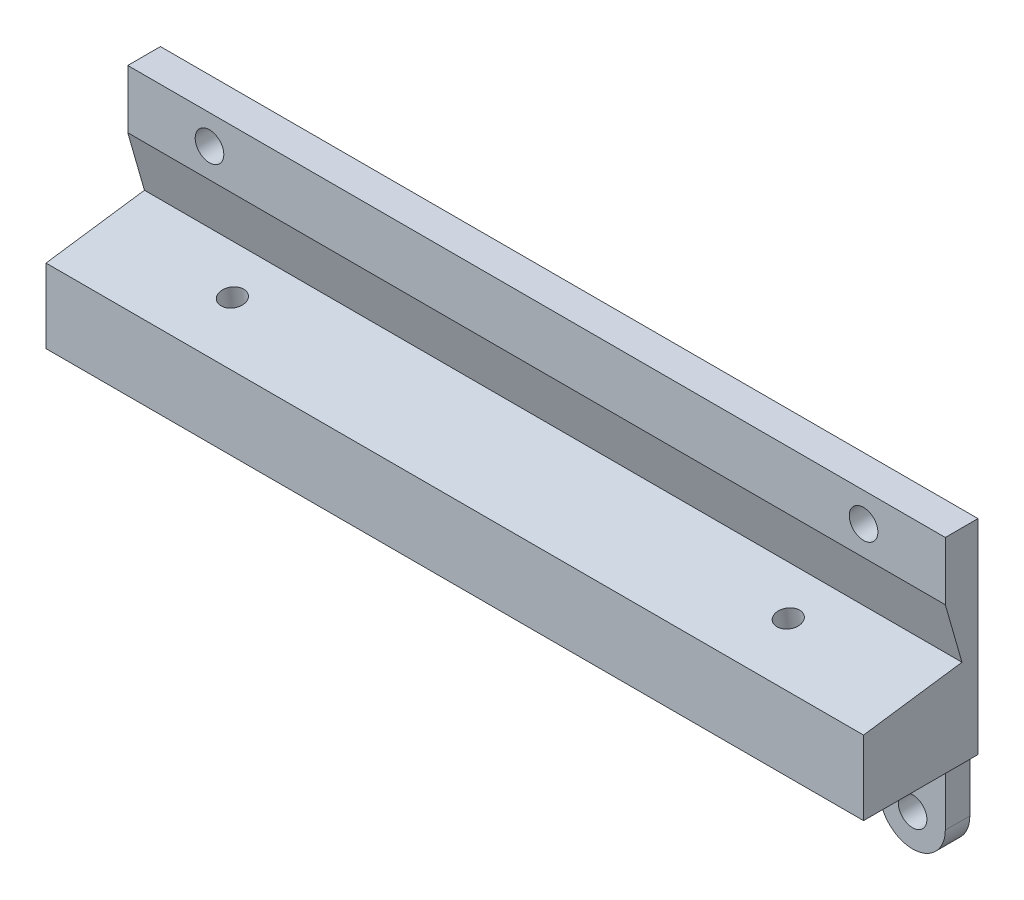
ISO-10303-21;
HEADER;
FILE_DESCRIPTION(('STEP AP214'),'2;1');
FILE_NAME('part.step','',(''),(''),'','','');
FILE_SCHEMA(('AUTOMOTIVE_DESIGN { 1 0 10303 214 1 1 1 1 }'));
ENDSEC;
DATA;
#1=APPLICATION_CONTEXT('core data for automotive mechanical design processes');
#2=APPLICATION_PROTOCOL_DEFINITION('international standard','automotive_design',2000,#1);
#3=PRODUCT_CONTEXT('',#1,'mechanical');
#4=PRODUCT('Part','Part','',(#3));
#5=PRODUCT_RELATED_PRODUCT_CATEGORY('part','',(#4));
#6=PRODUCT_DEFINITION_FORMATION('','',#4);
#7=PRODUCT_DEFINITION_CONTEXT('part definition',#1,'design');
#8=PRODUCT_DEFINITION('design','',#6,#7);
#9=PRODUCT_DEFINITION_SHAPE('','',#8);
#10=(LENGTH_UNIT() NAMED_UNIT(*) SI_UNIT(.MILLI.,.METRE.));
#11=(NAMED_UNIT(*) PLANE_ANGLE_UNIT() SI_UNIT($,.RADIAN.));
#12=(NAMED_UNIT(*) SI_UNIT($,.STERADIAN.) SOLID_ANGLE_UNIT());
#13=UNCERTAINTY_MEASURE_WITH_UNIT(LENGTH_MEASURE(1.E-05),#10,'distance_accuracy_value','');
#14=(GEOMETRIC_REPRESENTATION_CONTEXT(3) GLOBAL_UNCERTAINTY_ASSIGNED_CONTEXT((#13)) GLOBAL_UNIT_ASSIGNED_CONTEXT((#10,
#11,#12)) REPRESENTATION_CONTEXT('',''));
#15=CARTESIAN_POINT('',(0.,0.,0.));
#16=DIRECTION('',(0.,0.,1.));
#17=DIRECTION('',(1.,0.,0.));
#18=AXIS2_PLACEMENT_3D('',#15,#16,#17);
#19=CARTESIAN_POINT('',(0.,0.,4.));
#20=DIRECTION('',(0.,1.,0.));
#21=DIRECTION('',(0.,0.,1.));
#22=AXIS2_PLACEMENT_3D('',#19,#20,#21);
#23=PLANE('',#22);
#24=CARTESIAN_POINT('',(84.,0.,5.79817425479947));
#25=DIRECTION('',(0.,1.,0.));
#26=DIRECTION('',(0.,0.,1.));
#27=AXIS2_PLACEMENT_3D('',#24,#25,#26);
#28=ELLIPSE('',#27,1.41375860152607,1.4);
#29=CARTESIAN_POINT('',(84.,0.,7.21193285632554));
#30=VERTEX_POINT('',#29);
#31=EDGE_CURVE('E228',#30,#30,#28,.T.);
#32=ORIENTED_EDGE('',*,*,#31,.T.);
#33=EDGE_LOOP('',(#32));
#34=FACE_BOUND('',#33,.T.);
#35=CARTESIAN_POINT('',(16.,0.,5.79817425479947));
#36=DIRECTION('',(0.,1.,0.));
#37=DIRECTION('',(0.,0.,1.));
#38=AXIS2_PLACEMENT_3D('',#35,#36,#37);
#39=ELLIPSE('',#38,1.41375860152606,1.4);
#40=CARTESIAN_POINT('',(16.,0.,7.21193285632554));
#41=VERTEX_POINT('',#40);
#42=EDGE_CURVE('E233',#41,#41,#39,.T.);
#43=ORIENTED_EDGE('',*,*,#42,.T.);
#44=EDGE_LOOP('',(#43));
#45=FACE_BOUND('',#44,.T.);
#46=DIRECTION('',(1.,0.,0.));
#47=VECTOR('',#46,1.);
#48=CARTESIAN_POINT('',(9.00000000000001,0.,3.));
#49=LINE('',#48,#47);
#50=CARTESIAN_POINT('',(1.,0.,3.));
#51=VERTEX_POINT('',#50);
#52=CARTESIAN_POINT('',(9.00000000000001,0.,3.));
#53=VERTEX_POINT('',#52);
#54=EDGE_CURVE('E58',#51,#53,#49,.T.);
#55=ORIENTED_EDGE('',*,*,#54,.T.);
#56=DIRECTION('',(0.,0.,-1.));
#57=VECTOR('',#56,1.);
#58=CARTESIAN_POINT('',(9.00000000000001,0.,3.));
#59=LINE('',#58,#57);
#60=CARTESIAN_POINT('',(9.00000000000001,0.,0.));
#61=VERTEX_POINT('',#60);
#62=EDGE_CURVE('E154',#53,#61,#59,.T.);
#63=ORIENTED_EDGE('',*,*,#62,.T.);
#64=DIRECTION('',(1.,0.,0.));
#65=VECTOR('',#64,1.);
#66=CARTESIAN_POINT('',(0.,0.,0.));
#67=LINE('',#66,#65);
#68=CARTESIAN_POINT('',(91.,0.,0.));
#69=VERTEX_POINT('',#68);
#70=EDGE_CURVE('E171',#61,#69,#67,.T.);
#71=ORIENTED_EDGE('',*,*,#70,.T.);
#72=DIRECTION('',(0.,0.,-1.));
#73=VECTOR('',#72,1.);
#74=CARTESIAN_POINT('',(91.,0.,3.));
#75=LINE('',#74,#73);
#76=CARTESIAN_POINT('',(91.,0.,3.));
#77=VERTEX_POINT('',#76);
#78=EDGE_CURVE('E221',#77,#69,#75,.T.);
#79=ORIENTED_EDGE('',*,*,#78,.F.);
#80=DIRECTION('',(1.,0.,0.));
#81=VECTOR('',#80,1.);
#82=CARTESIAN_POINT('',(99.,0.,3.));
#83=LINE('',#82,#81);
#84=CARTESIAN_POINT('',(99.,0.,3.));
#85=VERTEX_POINT('',#84);
#86=EDGE_CURVE('E202',#77,#85,#83,.T.);
#87=ORIENTED_EDGE('',*,*,#86,.T.);
#88=DIRECTION('',(0.,0.,-1.));
#89=VECTOR('',#88,1.);
#90=CARTESIAN_POINT('',(99.,0.,3.));
#91=LINE('',#90,#89);
#92=CARTESIAN_POINT('',(99.,0.,0.));
#93=VERTEX_POINT('',#92);
#94=EDGE_CURVE('E218',#85,#93,#91,.T.);
#95=ORIENTED_EDGE('',*,*,#94,.T.);
#96=CARTESIAN_POINT('',(100.,0.,0.));
#97=VERTEX_POINT('',#96);
#98=EDGE_CURVE('E271',#93,#97,#67,.T.);
#99=ORIENTED_EDGE('',*,*,#98,.T.);
#100=DIRECTION('',(0.,0.,-1.));
#101=VECTOR('',#100,1.);
#102=CARTESIAN_POINT('',(100.,0.,4.));
#103=LINE('',#102,#101);
#104=CARTESIAN_POINT('',(100.,0.,14.));
#105=VERTEX_POINT('',#104);
#106=EDGE_CURVE('E282',#105,#97,#103,.T.);
#107=ORIENTED_EDGE('',*,*,#106,.F.);
#108=DIRECTION('',(1.,0.,0.));
#109=VECTOR('',#108,1.);
#110=CARTESIAN_POINT('',(100.,0.,14.));
#111=LINE('',#110,#109);
#112=CARTESIAN_POINT('',(0.,0.,14.));
#113=VERTEX_POINT('',#112);
#114=EDGE_CURVE('E256',#113,#105,#111,.T.);
#115=ORIENTED_EDGE('',*,*,#114,.F.);
#116=DIRECTION('',(0.,0.,-1.));
#117=VECTOR('',#116,1.);
#118=CARTESIAN_POINT('',(0.,0.,4.));
#119=LINE('',#118,#117);
#120=CARTESIAN_POINT('',(0.,0.,0.));
#121=VERTEX_POINT('',#120);
#122=EDGE_CURVE('E47',#113,#121,#119,.T.);
#123=ORIENTED_EDGE('',*,*,#122,.T.);
#124=CARTESIAN_POINT('',(1.,0.,0.));
#125=VERTEX_POINT('',#124);
#126=EDGE_CURVE('E272',#121,#125,#67,.T.);
#127=ORIENTED_EDGE('',*,*,#126,.T.);
#128=DIRECTION('',(0.,0.,-1.));
#129=VECTOR('',#128,1.);
#130=CARTESIAN_POINT('',(1.,0.,3.));
#131=LINE('',#130,#129);
#132=EDGE_CURVE('E54',#51,#125,#131,.T.);
#133=ORIENTED_EDGE('',*,*,#132,.F.);
#134=EDGE_LOOP('',(#55,#63,#71,#79,#87,#95,#99,#107,#115,#123,#127,#133));
#135=FACE_BOUND('',#134,.T.);
#136=ADVANCED_FACE('F39',(#34,#45,#135),#23,.F.);
#137=CARTESIAN_POINT('',(0.,0.,4.));
#138=DIRECTION('',(0.,0.,-1.));
#139=DIRECTION('',(-1.,0.,0.));
#140=AXIS2_PLACEMENT_3D('',#137,#138,#139);
#141=PLANE('',#140);
#142=CARTESIAN_POINT('',(10.,21.4371627327178,4.));
#143=DIRECTION('',(0.,0.,1.));
#144=DIRECTION('',(1.,0.,0.));
#145=AXIS2_PLACEMENT_3D('',#142,#143,#144);
#146=CIRCLE('',#145,1.75);
#147=CARTESIAN_POINT('',(11.75,21.4371627327178,4.));
#148=VERTEX_POINT('',#147);
#149=EDGE_CURVE('E306',#148,#148,#146,.T.);
#150=ORIENTED_EDGE('',*,*,#149,.F.);
#151=EDGE_LOOP('',(#150));
#152=FACE_BOUND('',#151,.T.);
#153=CARTESIAN_POINT('',(90.,21.4371627327178,4.));
#154=DIRECTION('',(0.,0.,1.));
#155=DIRECTION('',(1.,0.,0.));
#156=AXIS2_PLACEMENT_3D('',#153,#154,#155);
#157=CIRCLE('',#156,1.75);
#158=CARTESIAN_POINT('',(91.75,21.4371627327178,4.));
#159=VERTEX_POINT('',#158);
#160=EDGE_CURVE('E303',#159,#159,#157,.T.);
#161=ORIENTED_EDGE('',*,*,#160,.F.);
#162=EDGE_LOOP('',(#161));
#163=FACE_BOUND('',#162,.T.);
#164=DIRECTION('',(0.,-1.,0.));
#165=VECTOR('',#164,1.);
#166=CARTESIAN_POINT('',(0.,0.,4.));
#167=LINE('',#166,#165);
#168=CARTESIAN_POINT('',(0.,25.,4.));
#169=VERTEX_POINT('',#168);
#170=CARTESIAN_POINT('',(0.,17.8743254654356,4.));
#171=VERTEX_POINT('',#170);
#172=EDGE_CURVE('E260',#169,#171,#167,.T.);
#173=ORIENTED_EDGE('',*,*,#172,.T.);
#174=DIRECTION('',(-1.,0.,0.));
#175=VECTOR('',#174,1.);
#176=CARTESIAN_POINT('',(100.,17.8743254654356,4.));
#177=LINE('',#176,#175);
#178=CARTESIAN_POINT('',(100.,17.8743254654356,4.));
#179=VERTEX_POINT('',#178);
#180=EDGE_CURVE('E248',#179,#171,#177,.T.);
#181=ORIENTED_EDGE('',*,*,#180,.F.);
#182=DIRECTION('',(0.,1.,0.));
#183=VECTOR('',#182,1.);
#184=CARTESIAN_POINT('',(100.,0.,4.));
#185=LINE('',#184,#183);
#186=CARTESIAN_POINT('',(100.,25.,4.));
#187=VERTEX_POINT('',#186);
#188=EDGE_CURVE('E263',#179,#187,#185,.T.);
#189=ORIENTED_EDGE('',*,*,#188,.T.);
#190=DIRECTION('',(-1.,0.,0.));
#191=VECTOR('',#190,1.);
#192=CARTESIAN_POINT('',(0.,25.,4.));
#193=LINE('',#192,#191);
#194=EDGE_CURVE('E266',#187,#169,#193,.T.);
#195=ORIENTED_EDGE('',*,*,#194,.T.);
#196=EDGE_LOOP('',(#173,#181,#189,#195));
#197=FACE_BOUND('',#196,.T.);
#198=ADVANCED_FACE('F321',(#152,#163,#197),#141,.F.);
#199=CARTESIAN_POINT('',(0.,0.,4.));
#200=DIRECTION('',(1.,0.,0.));
#201=DIRECTION('',(0.,0.,-1.));
#202=AXIS2_PLACEMENT_3D('',#199,#200,#201);
#203=PLANE('',#202);
#204=DIRECTION('',(0.,-0.139173100960062,0.990268068741571));
#205=VECTOR('',#204,1.);
#206=CARTESIAN_POINT('',(0.,10.76,1.96));
#207=LINE('',#206,#205);
#208=CARTESIAN_POINT('',(0.,10.76,1.96));
#209=VERTEX_POINT('',#208);
#210=CARTESIAN_POINT('',(0.,9.06788835018324,14.));
#211=VERTEX_POINT('',#210);
#212=EDGE_CURVE('E241',#209,#211,#207,.T.);
#213=ORIENTED_EDGE('',*,*,#212,.F.);
#214=DIRECTION('',(0.,-0.961261695938321,-0.275637355816992));
#215=VECTOR('',#214,1.);
#216=CARTESIAN_POINT('',(0.,10.76,1.96));
#217=LINE('',#216,#215);
#218=EDGE_CURVE('E236',#171,#209,#217,.T.);
#219=ORIENTED_EDGE('',*,*,#218,.F.);
#220=ORIENTED_EDGE('',*,*,#172,.F.);
#221=DIRECTION('',(0.,0.,-1.));
#222=VECTOR('',#221,1.);
#223=CARTESIAN_POINT('',(0.,25.,4.));
#224=LINE('',#223,#222);
#225=CARTESIAN_POINT('',(0.,25.,0.));
#226=VERTEX_POINT('',#225);
#227=EDGE_CURVE('E268',#169,#226,#224,.T.);
#228=ORIENTED_EDGE('',*,*,#227,.T.);
#229=DIRECTION('',(0.,-1.,0.));
#230=VECTOR('',#229,1.);
#231=CARTESIAN_POINT('',(0.,0.,0.));
#232=LINE('',#231,#230);
#233=EDGE_CURVE('E259',#226,#121,#232,.T.);
#234=ORIENTED_EDGE('',*,*,#233,.T.);
#235=ORIENTED_EDGE('',*,*,#122,.F.);
#236=DIRECTION('',(0.,-1.,0.));
#237=VECTOR('',#236,1.);
#238=CARTESIAN_POINT('',(0.,0.,14.));
#239=LINE('',#238,#237);
#240=EDGE_CURVE('E254',#211,#113,#239,.T.);
#241=ORIENTED_EDGE('',*,*,#240,.F.);
#242=EDGE_LOOP('',(#213,#219,#220,#228,#234,#235,#241));
#243=FACE_BOUND('',#242,.T.);
#244=ADVANCED_FACE('F41',(#243),#203,.F.);
#245=CARTESIAN_POINT('',(100.,0.,4.));
#246=DIRECTION('',(-1.,0.,0.));
#247=DIRECTION('',(0.,0.,1.));
#248=AXIS2_PLACEMENT_3D('',#245,#246,#247);
#249=PLANE('',#248);
#250=ORIENTED_EDGE('',*,*,#188,.F.);
#251=DIRECTION('',(0.,-0.961261695938321,-0.275637355816992));
#252=VECTOR('',#251,1.);
#253=CARTESIAN_POINT('',(100.,10.76,1.96));
#254=LINE('',#253,#252);
#255=CARTESIAN_POINT('',(100.,10.76,1.96));
#256=VERTEX_POINT('',#255);
#257=EDGE_CURVE('E237',#179,#256,#254,.T.);
#258=ORIENTED_EDGE('',*,*,#257,.T.);
#259=DIRECTION('',(0.,-0.139173100960062,0.990268068741571));
#260=VECTOR('',#259,1.);
#261=CARTESIAN_POINT('',(100.,10.76,1.96));
#262=LINE('',#261,#260);
#263=CARTESIAN_POINT('',(100.,9.06788835018324,14.));
#264=VERTEX_POINT('',#263);
#265=EDGE_CURVE('E240',#256,#264,#262,.T.);
#266=ORIENTED_EDGE('',*,*,#265,.T.);
#267=DIRECTION('',(0.,1.,0.));
#268=VECTOR('',#267,1.);
#269=CARTESIAN_POINT('',(100.,0.,14.));
#270=LINE('',#269,#268);
#271=EDGE_CURVE('E250',#105,#264,#270,.T.);
#272=ORIENTED_EDGE('',*,*,#271,.F.);
#273=ORIENTED_EDGE('',*,*,#106,.T.);
#274=DIRECTION('',(0.,1.,0.));
#275=VECTOR('',#274,1.);
#276=CARTESIAN_POINT('',(100.,0.,0.));
#277=LINE('',#276,#275);
#278=CARTESIAN_POINT('',(100.,25.,0.));
#279=VERTEX_POINT('',#278);
#280=EDGE_CURVE('E274',#97,#279,#277,.T.);
#281=ORIENTED_EDGE('',*,*,#280,.T.);
#282=DIRECTION('',(0.,0.,-1.));
#283=VECTOR('',#282,1.);
#284=CARTESIAN_POINT('',(100.,25.,4.));
#285=LINE('',#284,#283);
#286=EDGE_CURVE('E279',#187,#279,#285,.T.);
#287=ORIENTED_EDGE('',*,*,#286,.F.);
#288=EDGE_LOOP('',(#250,#258,#266,#272,#273,#281,#287));
#289=FACE_BOUND('',#288,.T.);
#290=ADVANCED_FACE('F335',(#289),#249,.F.);
#291=CARTESIAN_POINT('',(0.,25.,4.));
#292=DIRECTION('',(0.,-1.,0.));
#293=DIRECTION('',(0.,0.,-1.));
#294=AXIS2_PLACEMENT_3D('',#291,#292,#293);
#295=PLANE('',#294);
#296=DIRECTION('',(-1.,0.,0.));
#297=VECTOR('',#296,1.);
#298=CARTESIAN_POINT('',(0.,25.,0.));
#299=LINE('',#298,#297);
#300=EDGE_CURVE('E264',#279,#226,#299,.T.);
#301=ORIENTED_EDGE('',*,*,#300,.T.);
#302=ORIENTED_EDGE('',*,*,#227,.F.);
#303=ORIENTED_EDGE('',*,*,#194,.F.);
#304=ORIENTED_EDGE('',*,*,#286,.T.);
#305=EDGE_LOOP('',(#301,#302,#303,#304));
#306=FACE_BOUND('',#305,.T.);
#307=ADVANCED_FACE('F339',(#306),#295,.F.);
#308=CARTESIAN_POINT('',(0.,0.,0.));
#309=DIRECTION('',(0.,0.,-1.));
#310=DIRECTION('',(-1.,0.,0.));
#311=AXIS2_PLACEMENT_3D('',#308,#309,#310);
#312=PLANE('',#311);
#313=CARTESIAN_POINT('',(10.,21.4371627327178,0.));
#314=DIRECTION('',(0.,0.,1.));
#315=DIRECTION('',(1.,0.,0.));
#316=AXIS2_PLACEMENT_3D('',#313,#314,#315);
#317=CIRCLE('',#316,1.75);
#318=CARTESIAN_POINT('',(11.75,21.4371627327178,0.));
#319=VERTEX_POINT('',#318);
#320=EDGE_CURVE('E155',#319,#319,#317,.T.);
#321=ORIENTED_EDGE('',*,*,#320,.T.);
#322=EDGE_LOOP('',(#321));
#323=FACE_BOUND('',#322,.T.);
#324=CARTESIAN_POINT('',(90.,21.4371627327178,0.));
#325=DIRECTION('',(0.,0.,1.));
#326=DIRECTION('',(1.,0.,0.));
#327=AXIS2_PLACEMENT_3D('',#324,#325,#326);
#328=CIRCLE('',#327,1.75);
#329=CARTESIAN_POINT('',(91.75,21.4371627327178,0.));
#330=VERTEX_POINT('',#329);
#331=EDGE_CURVE('E300',#330,#330,#328,.T.);
#332=ORIENTED_EDGE('',*,*,#331,.T.);
#333=EDGE_LOOP('',(#332));
#334=FACE_BOUND('',#333,.T.);
#335=ORIENTED_EDGE('',*,*,#233,.F.);
#336=ORIENTED_EDGE('',*,*,#300,.F.);
#337=ORIENTED_EDGE('',*,*,#280,.F.);
#338=ORIENTED_EDGE('',*,*,#98,.F.);
#339=DIRECTION('',(0.,-1.,0.));
#340=VECTOR('',#339,1.);
#341=CARTESIAN_POINT('',(99.,-7.,0.));
#342=LINE('',#341,#340);
#343=CARTESIAN_POINT('',(99.,-7.,0.));
#344=VERTEX_POINT('',#343);
#345=EDGE_CURVE('E199',#93,#344,#342,.T.);
#346=ORIENTED_EDGE('',*,*,#345,.T.);
#347=CARTESIAN_POINT('',(95.,-7.,0.));
#348=DIRECTION('',(0.,0.,-1.));
#349=DIRECTION('',(-1.,0.,0.));
#350=AXIS2_PLACEMENT_3D('',#347,#348,#349);
#351=CIRCLE('',#350,4.);
#352=CARTESIAN_POINT('',(91.,-7.,0.));
#353=VERTEX_POINT('',#352);
#354=EDGE_CURVE('E192',#344,#353,#351,.T.);
#355=ORIENTED_EDGE('',*,*,#354,.T.);
#356=DIRECTION('',(0.,1.,0.));
#357=VECTOR('',#356,1.);
#358=CARTESIAN_POINT('',(91.,-7.,0.));
#359=LINE('',#358,#357);
#360=EDGE_CURVE('E211',#353,#69,#359,.T.);
#361=ORIENTED_EDGE('',*,*,#360,.T.);
#362=ORIENTED_EDGE('',*,*,#70,.F.);
#363=DIRECTION('',(0.,-1.,0.));
#364=VECTOR('',#363,1.);
#365=CARTESIAN_POINT('',(9.00000000000001,-7.,0.));
#366=LINE('',#365,#364);
#367=CARTESIAN_POINT('',(9.00000000000001,-7.,0.));
#368=VERTEX_POINT('',#367);
#369=EDGE_CURVE('E148',#61,#368,#366,.T.);
#370=ORIENTED_EDGE('',*,*,#369,.T.);
#371=CARTESIAN_POINT('',(5.,-7.,0.));
#372=DIRECTION('',(0.,0.,-1.));
#373=DIRECTION('',(-1.,0.,0.));
#374=AXIS2_PLACEMENT_3D('',#371,#372,#373);
#375=CIRCLE('',#374,4.);
#376=CARTESIAN_POINT('',(1.,-7.,0.));
#377=VERTEX_POINT('',#376);
#378=EDGE_CURVE('E158',#368,#377,#375,.T.);
#379=ORIENTED_EDGE('',*,*,#378,.T.);
#380=DIRECTION('',(0.,1.,0.));
#381=VECTOR('',#380,1.);
#382=CARTESIAN_POINT('',(1.,-7.,0.));
#383=LINE('',#382,#381);
#384=EDGE_CURVE('E165',#377,#125,#383,.T.);
#385=ORIENTED_EDGE('',*,*,#384,.T.);
#386=ORIENTED_EDGE('',*,*,#126,.F.);
#387=EDGE_LOOP('',(#335,#336,#337,#338,#346,#355,#361,#362,#370,#379,#385,#386));
#388=FACE_BOUND('',#387,.T.);
#389=CARTESIAN_POINT('',(95.,-7.,0.));
#390=DIRECTION('',(0.,0.,-1.));
#391=DIRECTION('',(-1.,0.,0.));
#392=AXIS2_PLACEMENT_3D('',#389,#390,#391);
#393=CIRCLE('',#392,1.75);
#394=CARTESIAN_POINT('',(93.25,-7.,0.));
#395=VERTEX_POINT('',#394);
#396=EDGE_CURVE('E186',#395,#395,#393,.T.);
#397=ORIENTED_EDGE('',*,*,#396,.F.);
#398=EDGE_LOOP('',(#397));
#399=FACE_BOUND('',#398,.T.);
#400=CARTESIAN_POINT('',(5.,-7.,0.));
#401=DIRECTION('',(0.,0.,-1.));
#402=DIRECTION('',(-1.,0.,0.));
#403=AXIS2_PLACEMENT_3D('',#400,#401,#402);
#404=CIRCLE('',#403,1.75);
#405=CARTESIAN_POINT('',(3.25,-7.,0.));
#406=VERTEX_POINT('',#405);
#407=EDGE_CURVE('E183',#406,#406,#404,.T.);
#408=ORIENTED_EDGE('',*,*,#407,.F.);
#409=EDGE_LOOP('',(#408));
#410=FACE_BOUND('',#409,.T.);
#411=ADVANCED_FACE('F168',(#323,#334,#388,#399,#410),#312,.T.);
#412=CARTESIAN_POINT('',(0.,0.,14.));
#413=DIRECTION('',(0.,0.,1.));
#414=DIRECTION('',(1.,0.,0.));
#415=AXIS2_PLACEMENT_3D('',#412,#413,#414);
#416=PLANE('',#415);
#417=DIRECTION('',(1.,0.,0.));
#418=VECTOR('',#417,1.);
#419=CARTESIAN_POINT('',(0.,9.06788835018324,14.));
#420=LINE('',#419,#418);
#421=EDGE_CURVE('E11',#211,#264,#420,.T.);
#422=ORIENTED_EDGE('',*,*,#421,.F.);
#423=ORIENTED_EDGE('',*,*,#240,.T.);
#424=ORIENTED_EDGE('',*,*,#114,.T.);
#425=ORIENTED_EDGE('',*,*,#271,.T.);
#426=EDGE_LOOP('',(#422,#423,#424,#425));
#427=FACE_BOUND('',#426,.T.);
#428=ADVANCED_FACE('F346',(#427),#416,.T.);
#429=CARTESIAN_POINT('',(100.,10.76,1.96));
#430=DIRECTION('',(0.,0.275637355816992,-0.961261695938321));
#431=DIRECTION('',(0.,0.961261695938321,0.275637355816992));
#432=AXIS2_PLACEMENT_3D('',#429,#430,#431);
#433=PLANE('',#432);
#434=ORIENTED_EDGE('',*,*,#218,.T.);
#435=DIRECTION('',(-1.,0.,0.));
#436=VECTOR('',#435,1.);
#437=CARTESIAN_POINT('',(100.,10.76,1.96));
#438=LINE('',#437,#436);
#439=EDGE_CURVE('E244',#256,#209,#438,.T.);
#440=ORIENTED_EDGE('',*,*,#439,.F.);
#441=ORIENTED_EDGE('',*,*,#257,.F.);
#442=ORIENTED_EDGE('',*,*,#180,.T.);
#443=EDGE_LOOP('',(#434,#440,#441,#442));
#444=FACE_BOUND('',#443,.T.);
#445=ADVANCED_FACE('F332',(#444),#433,.F.);
#446=CARTESIAN_POINT('',(100.,10.76,1.96));
#447=DIRECTION('',(0.,-0.990268068741571,-0.139173100960062));
#448=DIRECTION('',(0.,0.139173100960062,-0.990268068741571));
#449=AXIS2_PLACEMENT_3D('',#446,#447,#448);
#450=PLANE('',#449);
#451=CARTESIAN_POINT('',(16.,10.0226158227693,7.20676104843283));
#452=DIRECTION('',(0.,0.990268068741571,0.139173100960062));
#453=DIRECTION('',(0.,-0.139173100960062,0.990268068741571));
#454=AXIS2_PLACEMENT_3D('',#451,#452,#453);
#455=CIRCLE('',#454,1.4);
#456=CARTESIAN_POINT('',(16.,9.82777348142518,8.59313634467102));
#457=VERTEX_POINT('',#456);
#458=EDGE_CURVE('E225',#457,#457,#455,.T.);
#459=ORIENTED_EDGE('',*,*,#458,.F.);
#460=EDGE_LOOP('',(#459));
#461=FACE_BOUND('',#460,.T.);
#462=CARTESIAN_POINT('',(84.,10.0226158227693,7.20676104843283));
#463=DIRECTION('',(0.,0.990268068741571,0.139173100960062));
#464=DIRECTION('',(0.,-0.139173100960062,0.990268068741571));
#465=AXIS2_PLACEMENT_3D('',#462,#463,#464);
#466=CIRCLE('',#465,1.4);
#467=CARTESIAN_POINT('',(84.,9.82777348142518,8.59313634467103));
#468=VERTEX_POINT('',#467);
#469=EDGE_CURVE('E217',#468,#468,#466,.T.);
#470=ORIENTED_EDGE('',*,*,#469,.F.);
#471=EDGE_LOOP('',(#470));
#472=FACE_BOUND('',#471,.T.);
#473=ORIENTED_EDGE('',*,*,#421,.T.);
#474=ORIENTED_EDGE('',*,*,#265,.F.);
#475=ORIENTED_EDGE('',*,*,#439,.T.);
#476=ORIENTED_EDGE('',*,*,#212,.T.);
#477=EDGE_LOOP('',(#473,#474,#475,#476));
#478=FACE_BOUND('',#477,.T.);
#479=ADVANCED_FACE('F371',(#461,#472,#478),#450,.F.);
#480=CARTESIAN_POINT('',(84.,-0.799096710079545,5.68586853615696));
#481=DIRECTION('',(0.,0.990268068741571,0.139173100960062));
#482=DIRECTION('',(0.,-0.139173100960062,0.990268068741571));
#483=AXIS2_PLACEMENT_3D('',#480,#481,#482);
#484=CYLINDRICAL_SURFACE('',#483,1.4);
#485=ORIENTED_EDGE('',*,*,#469,.T.);
#486=EDGE_LOOP('',(#485));
#487=FACE_BOUND('',#486,.T.);
#488=ORIENTED_EDGE('',*,*,#31,.F.);
#489=EDGE_LOOP('',(#488));
#490=FACE_BOUND('',#489,.T.);
#491=ADVANCED_FACE('F362',(#487,#490),#484,.F.);
#492=CARTESIAN_POINT('',(16.,-0.799096710079545,5.68586853615696));
#493=DIRECTION('',(0.,0.990268068741571,0.139173100960062));
#494=DIRECTION('',(0.,-0.139173100960062,0.990268068741571));
#495=AXIS2_PLACEMENT_3D('',#492,#493,#494);
#496=CYLINDRICAL_SURFACE('',#495,1.4);
#497=ORIENTED_EDGE('',*,*,#458,.T.);
#498=EDGE_LOOP('',(#497));
#499=FACE_BOUND('',#498,.T.);
#500=ORIENTED_EDGE('',*,*,#42,.F.);
#501=EDGE_LOOP('',(#500));
#502=FACE_BOUND('',#501,.T.);
#503=ADVANCED_FACE('F360',(#499,#502),#496,.F.);
#504=CARTESIAN_POINT('',(95.,-7.,3.));
#505=DIRECTION('',(0.,0.,-1.));
#506=DIRECTION('',(-1.,0.,0.));
#507=AXIS2_PLACEMENT_3D('',#504,#505,#506);
#508=CYLINDRICAL_SURFACE('',#507,4.);
#509=ORIENTED_EDGE('',*,*,#354,.F.);
#510=DIRECTION('',(0.,0.,-1.));
#511=VECTOR('',#510,1.);
#512=CARTESIAN_POINT('',(99.,-7.,3.));
#513=LINE('',#512,#511);
#514=CARTESIAN_POINT('',(99.,-7.,3.));
#515=VERTEX_POINT('',#514);
#516=EDGE_CURVE('E215',#515,#344,#513,.T.);
#517=ORIENTED_EDGE('',*,*,#516,.F.);
#518=CARTESIAN_POINT('',(95.,-7.,3.));
#519=DIRECTION('',(0.,0.,-1.));
#520=DIRECTION('',(-1.,0.,0.));
#521=AXIS2_PLACEMENT_3D('',#518,#519,#520);
#522=CIRCLE('',#521,4.);
#523=CARTESIAN_POINT('',(91.,-7.,3.));
#524=VERTEX_POINT('',#523);
#525=EDGE_CURVE('E195',#515,#524,#522,.T.);
#526=ORIENTED_EDGE('',*,*,#525,.T.);
#527=DIRECTION('',(0.,0.,-1.));
#528=VECTOR('',#527,1.);
#529=CARTESIAN_POINT('',(91.,-7.,3.));
#530=LINE('',#529,#528);
#531=EDGE_CURVE('E208',#524,#353,#530,.T.);
#532=ORIENTED_EDGE('',*,*,#531,.T.);
#533=EDGE_LOOP('',(#509,#517,#526,#532));
#534=FACE_BOUND('',#533,.T.);
#535=ADVANCED_FACE('F361',(#534),#508,.T.);
#536=CARTESIAN_POINT('',(99.,-7.,3.));
#537=DIRECTION('',(1.,0.,0.));
#538=DIRECTION('',(0.,0.,-1.));
#539=AXIS2_PLACEMENT_3D('',#536,#537,#538);
#540=PLANE('',#539);
#541=ORIENTED_EDGE('',*,*,#345,.F.);
#542=ORIENTED_EDGE('',*,*,#94,.F.);
#543=DIRECTION('',(0.,-1.,0.));
#544=VECTOR('',#543,1.);
#545=CARTESIAN_POINT('',(99.,-7.,3.));
#546=LINE('',#545,#544);
#547=EDGE_CURVE('E205',#85,#515,#546,.T.);
#548=ORIENTED_EDGE('',*,*,#547,.T.);
#549=ORIENTED_EDGE('',*,*,#516,.T.);
#550=EDGE_LOOP('',(#541,#542,#548,#549));
#551=FACE_BOUND('',#550,.T.);
#552=ADVANCED_FACE('F368',(#551),#540,.T.);
#553=CARTESIAN_POINT('',(91.,-7.,3.));
#554=DIRECTION('',(-1.,0.,0.));
#555=DIRECTION('',(0.,0.,1.));
#556=AXIS2_PLACEMENT_3D('',#553,#554,#555);
#557=PLANE('',#556);
#558=ORIENTED_EDGE('',*,*,#360,.F.);
#559=ORIENTED_EDGE('',*,*,#531,.F.);
#560=DIRECTION('',(0.,1.,0.));
#561=VECTOR('',#560,1.);
#562=CARTESIAN_POINT('',(91.,-7.,3.));
#563=LINE('',#562,#561);
#564=EDGE_CURVE('E198',#524,#77,#563,.T.);
#565=ORIENTED_EDGE('',*,*,#564,.T.);
#566=ORIENTED_EDGE('',*,*,#78,.T.);
#567=EDGE_LOOP('',(#558,#559,#565,#566));
#568=FACE_BOUND('',#567,.T.);
#569=ADVANCED_FACE('F391',(#568),#557,.T.);
#570=CARTESIAN_POINT('',(95.,-7.,3.));
#571=DIRECTION('',(0.,0.,-1.));
#572=DIRECTION('',(-1.,0.,0.));
#573=AXIS2_PLACEMENT_3D('',#570,#571,#572);
#574=PLANE('',#573);
#575=CARTESIAN_POINT('',(95.,-7.,3.));
#576=DIRECTION('',(0.,0.,-1.));
#577=DIRECTION('',(-1.,0.,0.));
#578=AXIS2_PLACEMENT_3D('',#575,#576,#577);
#579=CIRCLE('',#578,1.75);
#580=CARTESIAN_POINT('',(93.25,-7.,3.));
#581=VERTEX_POINT('',#580);
#582=EDGE_CURVE('E189',#581,#581,#579,.T.);
#583=ORIENTED_EDGE('',*,*,#582,.T.);
#584=EDGE_LOOP('',(#583));
#585=FACE_BOUND('',#584,.T.);
#586=ORIENTED_EDGE('',*,*,#525,.F.);
#587=ORIENTED_EDGE('',*,*,#547,.F.);
#588=ORIENTED_EDGE('',*,*,#86,.F.);
#589=ORIENTED_EDGE('',*,*,#564,.F.);
#590=EDGE_LOOP('',(#586,#587,#588,#589));
#591=FACE_BOUND('',#590,.T.);
#592=ADVANCED_FACE('F396',(#585,#591),#574,.F.);
#593=CARTESIAN_POINT('',(95.,-7.,3.));
#594=DIRECTION('',(0.,0.,-1.));
#595=DIRECTION('',(-1.,0.,0.));
#596=AXIS2_PLACEMENT_3D('',#593,#594,#595);
#597=CYLINDRICAL_SURFACE('',#596,1.75);
#598=ORIENTED_EDGE('',*,*,#582,.F.);
#599=EDGE_LOOP('',(#598));
#600=FACE_BOUND('',#599,.T.);
#601=ORIENTED_EDGE('',*,*,#396,.T.);
#602=EDGE_LOOP('',(#601));
#603=FACE_BOUND('',#602,.T.);
#604=ADVANCED_FACE('F407',(#600,#603),#597,.F.);
#605=CARTESIAN_POINT('',(5.,-7.,3.));
#606=DIRECTION('',(0.,0.,-1.));
#607=DIRECTION('',(-1.,0.,0.));
#608=AXIS2_PLACEMENT_3D('',#605,#606,#607);
#609=CYLINDRICAL_SURFACE('',#608,4.);
#610=ORIENTED_EDGE('',*,*,#378,.F.);
#611=DIRECTION('',(0.,0.,-1.));
#612=VECTOR('',#611,1.);
#613=CARTESIAN_POINT('',(9.00000000000001,-7.,3.));
#614=LINE('',#613,#612);
#615=CARTESIAN_POINT('',(9.00000000000001,-7.,3.));
#616=VERTEX_POINT('',#615);
#617=EDGE_CURVE('E144',#616,#368,#614,.T.);
#618=ORIENTED_EDGE('',*,*,#617,.F.);
#619=CARTESIAN_POINT('',(5.,-7.,3.));
#620=DIRECTION('',(0.,0.,-1.));
#621=DIRECTION('',(-1.,0.,0.));
#622=AXIS2_PLACEMENT_3D('',#619,#620,#621);
#623=CIRCLE('',#622,4.);
#624=CARTESIAN_POINT('',(1.,-7.,3.));
#625=VERTEX_POINT('',#624);
#626=EDGE_CURVE('E172',#616,#625,#623,.T.);
#627=ORIENTED_EDGE('',*,*,#626,.T.);
#628=DIRECTION('',(0.,0.,-1.));
#629=VECTOR('',#628,1.);
#630=CARTESIAN_POINT('',(1.,-7.,3.));
#631=LINE('',#630,#629);
#632=EDGE_CURVE('E160',#625,#377,#631,.T.);
#633=ORIENTED_EDGE('',*,*,#632,.T.);
#634=EDGE_LOOP('',(#610,#618,#627,#633));
#635=FACE_BOUND('',#634,.T.);
#636=ADVANCED_FACE('F159',(#635),#609,.T.);
#637=CARTESIAN_POINT('',(9.00000000000001,-7.,3.));
#638=DIRECTION('',(1.,0.,0.));
#639=DIRECTION('',(0.,0.,-1.));
#640=AXIS2_PLACEMENT_3D('',#637,#638,#639);
#641=PLANE('',#640);
#642=ORIENTED_EDGE('',*,*,#369,.F.);
#643=ORIENTED_EDGE('',*,*,#62,.F.);
#644=DIRECTION('',(0.,-1.,0.));
#645=VECTOR('',#644,1.);
#646=CARTESIAN_POINT('',(9.00000000000001,-7.,3.));
#647=LINE('',#646,#645);
#648=EDGE_CURVE('E150',#53,#616,#647,.T.);
#649=ORIENTED_EDGE('',*,*,#648,.T.);
#650=ORIENTED_EDGE('',*,*,#617,.T.);
#651=EDGE_LOOP('',(#642,#643,#649,#650));
#652=FACE_BOUND('',#651,.T.);
#653=ADVANCED_FACE('F146',(#652),#641,.T.);
#654=CARTESIAN_POINT('',(1.,-7.,3.));
#655=DIRECTION('',(-1.,0.,0.));
#656=DIRECTION('',(0.,0.,1.));
#657=AXIS2_PLACEMENT_3D('',#654,#655,#656);
#658=PLANE('',#657);
#659=ORIENTED_EDGE('',*,*,#384,.F.);
#660=ORIENTED_EDGE('',*,*,#632,.F.);
#661=DIRECTION('',(0.,1.,0.));
#662=VECTOR('',#661,1.);
#663=CARTESIAN_POINT('',(1.,-7.,3.));
#664=LINE('',#663,#662);
#665=EDGE_CURVE('E175',#625,#51,#664,.T.);
#666=ORIENTED_EDGE('',*,*,#665,.T.);
#667=ORIENTED_EDGE('',*,*,#132,.T.);
#668=EDGE_LOOP('',(#659,#660,#666,#667));
#669=FACE_BOUND('',#668,.T.);
#670=ADVANCED_FACE('F295',(#669),#658,.T.);
#671=CARTESIAN_POINT('',(5.,-7.,3.));
#672=DIRECTION('',(0.,0.,-1.));
#673=DIRECTION('',(-1.,0.,0.));
#674=AXIS2_PLACEMENT_3D('',#671,#672,#673);
#675=PLANE('',#674);
#676=CARTESIAN_POINT('',(5.,-7.,3.));
#677=DIRECTION('',(0.,0.,-1.));
#678=DIRECTION('',(-1.,0.,0.));
#679=AXIS2_PLACEMENT_3D('',#676,#677,#678);
#680=CIRCLE('',#679,1.75);
#681=CARTESIAN_POINT('',(3.25,-7.,3.));
#682=VERTEX_POINT('',#681);
#683=EDGE_CURVE('E164',#682,#682,#680,.T.);
#684=ORIENTED_EDGE('',*,*,#683,.T.);
#685=EDGE_LOOP('',(#684));
#686=FACE_BOUND('',#685,.T.);
#687=ORIENTED_EDGE('',*,*,#626,.F.);
#688=ORIENTED_EDGE('',*,*,#648,.F.);
#689=ORIENTED_EDGE('',*,*,#54,.F.);
#690=ORIENTED_EDGE('',*,*,#665,.F.);
#691=EDGE_LOOP('',(#687,#688,#689,#690));
#692=FACE_BOUND('',#691,.T.);
#693=ADVANCED_FACE('F415',(#686,#692),#675,.F.);
#694=CARTESIAN_POINT('',(5.,-7.,3.));
#695=DIRECTION('',(0.,0.,-1.));
#696=DIRECTION('',(-1.,0.,0.));
#697=AXIS2_PLACEMENT_3D('',#694,#695,#696);
#698=CYLINDRICAL_SURFACE('',#697,1.75);
#699=ORIENTED_EDGE('',*,*,#683,.F.);
#700=EDGE_LOOP('',(#699));
#701=FACE_BOUND('',#700,.T.);
#702=ORIENTED_EDGE('',*,*,#407,.T.);
#703=EDGE_LOOP('',(#702));
#704=FACE_BOUND('',#703,.T.);
#705=ADVANCED_FACE('F412',(#701,#704),#698,.F.);
#706=CARTESIAN_POINT('',(90.,21.4371627327178,0.));
#707=DIRECTION('',(0.,0.,1.));
#708=DIRECTION('',(1.,0.,0.));
#709=AXIS2_PLACEMENT_3D('',#706,#707,#708);
#710=CYLINDRICAL_SURFACE('',#709,1.75);
#711=ORIENTED_EDGE('',*,*,#331,.F.);
#712=EDGE_LOOP('',(#711));
#713=FACE_BOUND('',#712,.T.);
#714=ORIENTED_EDGE('',*,*,#160,.T.);
#715=EDGE_LOOP('',(#714));
#716=FACE_BOUND('',#715,.T.);
#717=ADVANCED_FACE('F317',(#713,#716),#710,.F.);
#718=CARTESIAN_POINT('',(10.,21.4371627327178,0.));
#719=DIRECTION('',(0.,0.,1.));
#720=DIRECTION('',(1.,0.,0.));
#721=AXIS2_PLACEMENT_3D('',#718,#719,#720);
#722=CYLINDRICAL_SURFACE('',#721,1.75);
#723=ORIENTED_EDGE('',*,*,#320,.F.);
#724=EDGE_LOOP('',(#723));
#725=FACE_BOUND('',#724,.T.);
#726=ORIENTED_EDGE('',*,*,#149,.T.);
#727=EDGE_LOOP('',(#726));
#728=FACE_BOUND('',#727,.T.);
#729=ADVANCED_FACE('F314',(#725,#728),#722,.F.);
#730=CLOSED_SHELL('',(#136,#198,#244,#290,#307,#411,#428,#445,#479,#491,#503,#535,#552,#569,
#592,#604,#636,#653,#670,#693,#705,#717,#729));
#731=MANIFOLD_SOLID_BREP('B2',#730);
#732=ADVANCED_BREP_SHAPE_REPRESENTATION('',(#18,#731),#14);
#733=SHAPE_DEFINITION_REPRESENTATION(#9,#732);
ENDSEC;
END-ISO-10303-21;
